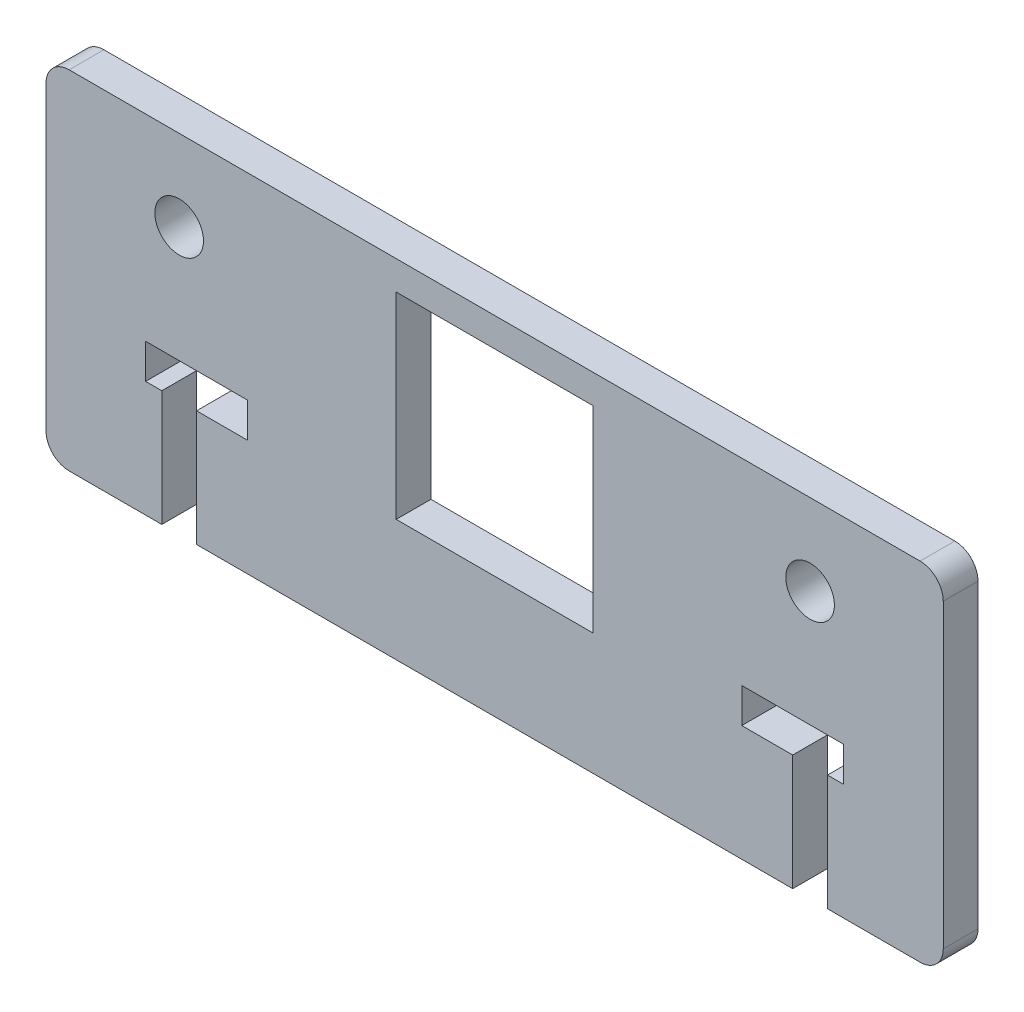
ISO-10303-21;
HEADER;
FILE_DESCRIPTION(('STEP AP214'),'2;1');
FILE_NAME('part.step','',(''),(''),'','','');
FILE_SCHEMA(('AUTOMOTIVE_DESIGN { 1 0 10303 214 1 1 1 1 }'));
ENDSEC;
DATA;
#1=APPLICATION_CONTEXT('core data for automotive mechanical design processes');
#2=APPLICATION_PROTOCOL_DEFINITION('international standard','automotive_design',2000,#1);
#3=PRODUCT_CONTEXT('',#1,'mechanical');
#4=PRODUCT('Part','Part','',(#3));
#5=PRODUCT_RELATED_PRODUCT_CATEGORY('part','',(#4));
#6=PRODUCT_DEFINITION_FORMATION('','',#4);
#7=PRODUCT_DEFINITION_CONTEXT('part definition',#1,'design');
#8=PRODUCT_DEFINITION('design','',#6,#7);
#9=PRODUCT_DEFINITION_SHAPE('','',#8);
#10=(LENGTH_UNIT() NAMED_UNIT(*) SI_UNIT(.MILLI.,.METRE.));
#11=(NAMED_UNIT(*) PLANE_ANGLE_UNIT() SI_UNIT($,.RADIAN.));
#12=(NAMED_UNIT(*) SI_UNIT($,.STERADIAN.) SOLID_ANGLE_UNIT());
#13=UNCERTAINTY_MEASURE_WITH_UNIT(LENGTH_MEASURE(1.E-05),#10,'distance_accuracy_value','');
#14=(GEOMETRIC_REPRESENTATION_CONTEXT(3) GLOBAL_UNCERTAINTY_ASSIGNED_CONTEXT((#13)) GLOBAL_UNIT_ASSIGNED_CONTEXT((#10,
#11,#12)) REPRESENTATION_CONTEXT('',''));
#15=CARTESIAN_POINT('',(0.,0.,0.));
#16=DIRECTION('',(0.,0.,1.));
#17=DIRECTION('',(1.,0.,0.));
#18=AXIS2_PLACEMENT_3D('',#15,#16,#17);
#19=CARTESIAN_POINT('',(0.,0.,1.5));
#20=DIRECTION('',(0.,0.,1.));
#21=DIRECTION('',(1.,0.,0.));
#22=AXIS2_PLACEMENT_3D('',#19,#20,#21);
#23=PLANE('',#22);
#24=CARTESIAN_POINT('',(27.94,53.4586120346529,1.5));
#25=DIRECTION('',(0.,0.,1.));
#26=DIRECTION('',(1.,0.,0.));
#27=AXIS2_PLACEMENT_3D('',#24,#25,#26);
#28=CIRCLE('',#27,1.05);
#29=CARTESIAN_POINT('',(28.99,53.4586120346529,1.5));
#30=VERTEX_POINT('',#29);
#31=EDGE_CURVE('E264',#30,#30,#28,.T.);
#32=ORIENTED_EDGE('',*,*,#31,.F.);
#33=EDGE_LOOP('',(#32));
#34=FACE_BOUND('',#33,.T.);
#35=DIRECTION('',(1.,0.,0.));
#36=VECTOR('',#35,1.);
#37=CARTESIAN_POINT('',(33.69,41.9586120346529,1.5));
#38=LINE('',#37,#36);
#39=CARTESIAN_POINT('',(28.69,41.9586120346529,1.5));
#40=VERTEX_POINT('',#39);
#41=CARTESIAN_POINT('',(32.69,41.9586120346529,1.5));
#42=VERTEX_POINT('',#41);
#43=EDGE_CURVE('E313',#40,#42,#38,.T.);
#44=ORIENTED_EDGE('',*,*,#43,.T.);
#45=CARTESIAN_POINT('',(32.69,42.9586120346529,1.5));
#46=DIRECTION('',(0.,0.,1.));
#47=DIRECTION('',(1.,0.,0.));
#48=AXIS2_PLACEMENT_3D('',#45,#46,#47);
#49=CIRCLE('',#48,1.);
#50=CARTESIAN_POINT('',(33.69,42.9586120346529,1.5));
#51=VERTEX_POINT('',#50);
#52=EDGE_CURVE('E502',#42,#51,#49,.T.);
#53=ORIENTED_EDGE('',*,*,#52,.T.);
#54=DIRECTION('',(0.,1.,0.));
#55=VECTOR('',#54,1.);
#56=CARTESIAN_POINT('',(33.69,56.9586120346529,1.5));
#57=LINE('',#56,#55);
#58=CARTESIAN_POINT('',(33.69,55.9586120346529,1.5));
#59=VERTEX_POINT('',#58);
#60=EDGE_CURVE('E317',#51,#59,#57,.T.);
#61=ORIENTED_EDGE('',*,*,#60,.T.);
#62=CARTESIAN_POINT('',(32.69,55.9586120346529,1.5));
#63=DIRECTION('',(0.,0.,1.));
#64=DIRECTION('',(1.,0.,0.));
#65=AXIS2_PLACEMENT_3D('',#62,#63,#64);
#66=CIRCLE('',#65,1.);
#67=CARTESIAN_POINT('',(32.69,56.9586120346529,1.5));
#68=VERTEX_POINT('',#67);
#69=EDGE_CURVE('E499',#59,#68,#66,.T.);
#70=ORIENTED_EDGE('',*,*,#69,.T.);
#71=DIRECTION('',(-1.,0.,0.));
#72=VECTOR('',#71,1.);
#73=CARTESIAN_POINT('',(14.32,56.9586120346529,1.5));
#74=LINE('',#73,#72);
#75=CARTESIAN_POINT('',(-4.05,56.9586120346529,1.5));
#76=VERTEX_POINT('',#75);
#77=EDGE_CURVE('E321',#68,#76,#74,.T.);
#78=ORIENTED_EDGE('',*,*,#77,.T.);
#79=CARTESIAN_POINT('',(-4.05,55.9586120346529,1.5));
#80=DIRECTION('',(0.,0.,1.));
#81=DIRECTION('',(1.,0.,0.));
#82=AXIS2_PLACEMENT_3D('',#79,#80,#81);
#83=CIRCLE('',#82,1.);
#84=CARTESIAN_POINT('',(-5.05,55.9586120346529,1.5));
#85=VERTEX_POINT('',#84);
#86=EDGE_CURVE('E494',#76,#85,#83,.T.);
#87=ORIENTED_EDGE('',*,*,#86,.T.);
#88=DIRECTION('',(0.,-1.,0.));
#89=VECTOR('',#88,1.);
#90=CARTESIAN_POINT('',(-5.05,41.9586120346529,1.5));
#91=LINE('',#90,#89);
#92=CARTESIAN_POINT('',(-5.05,42.9586120346529,1.5));
#93=VERTEX_POINT('',#92);
#94=EDGE_CURVE('E325',#85,#93,#91,.T.);
#95=ORIENTED_EDGE('',*,*,#94,.T.);
#96=CARTESIAN_POINT('',(-4.05,42.9586120346529,1.5));
#97=DIRECTION('',(0.,0.,1.));
#98=DIRECTION('',(1.,0.,0.));
#99=AXIS2_PLACEMENT_3D('',#96,#97,#98);
#100=CIRCLE('',#99,1.);
#101=CARTESIAN_POINT('',(-4.05,41.9586120346529,1.5));
#102=VERTEX_POINT('',#101);
#103=EDGE_CURVE('E54',#93,#102,#100,.T.);
#104=ORIENTED_EDGE('',*,*,#103,.T.);
#105=DIRECTION('',(1.,0.,0.));
#106=VECTOR('',#105,1.);
#107=CARTESIAN_POINT('',(-0.0499999999999987,41.9586120346529,1.5));
#108=LINE('',#107,#106);
#109=CARTESIAN_POINT('',(-0.0499999999999987,41.9586120346529,1.5));
#110=VERTEX_POINT('',#109);
#111=EDGE_CURVE('E328',#102,#110,#108,.T.);
#112=ORIENTED_EDGE('',*,*,#111,.T.);
#113=DIRECTION('',(0.,1.,0.));
#114=VECTOR('',#113,1.);
#115=CARTESIAN_POINT('',(-0.0500000000000014,46.9586120346529,1.5));
#116=LINE('',#115,#114);
#117=CARTESIAN_POINT('',(-0.0500000000000014,46.9586120346529,1.5));
#118=VERTEX_POINT('',#117);
#119=EDGE_CURVE('E331',#110,#118,#116,.T.);
#120=ORIENTED_EDGE('',*,*,#119,.T.);
#121=DIRECTION('',(-1.,0.,0.));
#122=VECTOR('',#121,1.);
#123=CARTESIAN_POINT('',(-0.749999999999999,46.9586120346529,1.5));
#124=LINE('',#123,#122);
#125=CARTESIAN_POINT('',(-0.749999999999999,46.9586120346529,1.5));
#126=VERTEX_POINT('',#125);
#127=EDGE_CURVE('E334',#118,#126,#124,.T.);
#128=ORIENTED_EDGE('',*,*,#127,.T.);
#129=DIRECTION('',(0.,1.,0.));
#130=VECTOR('',#129,1.);
#131=CARTESIAN_POINT('',(-0.749999999999999,48.4586120346529,1.5));
#132=LINE('',#131,#130);
#133=CARTESIAN_POINT('',(-0.749999999999999,48.4586120346529,1.5));
#134=VERTEX_POINT('',#133);
#135=EDGE_CURVE('E337',#126,#134,#132,.T.);
#136=ORIENTED_EDGE('',*,*,#135,.T.);
#137=DIRECTION('',(1.,0.,0.));
#138=VECTOR('',#137,1.);
#139=CARTESIAN_POINT('',(3.65,48.4586120346529,1.5));
#140=LINE('',#139,#138);
#141=CARTESIAN_POINT('',(3.65,48.4586120346529,1.5));
#142=VERTEX_POINT('',#141);
#143=EDGE_CURVE('E340',#134,#142,#140,.T.);
#144=ORIENTED_EDGE('',*,*,#143,.T.);
#145=DIRECTION('',(0.,-1.,0.));
#146=VECTOR('',#145,1.);
#147=CARTESIAN_POINT('',(3.65,46.9586120346529,1.5));
#148=LINE('',#147,#146);
#149=CARTESIAN_POINT('',(3.65,46.9586120346529,1.5));
#150=VERTEX_POINT('',#149);
#151=EDGE_CURVE('E343',#142,#150,#148,.T.);
#152=ORIENTED_EDGE('',*,*,#151,.T.);
#153=DIRECTION('',(-1.,0.,0.));
#154=VECTOR('',#153,1.);
#155=CARTESIAN_POINT('',(1.45,46.9586120346529,1.5));
#156=LINE('',#155,#154);
#157=CARTESIAN_POINT('',(1.45,46.9586120346529,1.5));
#158=VERTEX_POINT('',#157);
#159=EDGE_CURVE('E281',#150,#158,#156,.T.);
#160=ORIENTED_EDGE('',*,*,#159,.T.);
#161=DIRECTION('',(0.,-1.,0.));
#162=VECTOR('',#161,1.);
#163=CARTESIAN_POINT('',(1.45,41.9586120346529,1.5));
#164=LINE('',#163,#162);
#165=CARTESIAN_POINT('',(1.45,41.9586120346529,1.5));
#166=VERTEX_POINT('',#165);
#167=EDGE_CURVE('E285',#158,#166,#164,.T.);
#168=ORIENTED_EDGE('',*,*,#167,.T.);
#169=DIRECTION('',(1.,0.,0.));
#170=VECTOR('',#169,1.);
#171=CARTESIAN_POINT('',(1.45,41.9586120346529,1.5));
#172=LINE('',#171,#170);
#173=CARTESIAN_POINT('',(27.19,41.9586120346529,1.5));
#174=VERTEX_POINT('',#173);
#175=EDGE_CURVE('E289',#166,#174,#172,.T.);
#176=ORIENTED_EDGE('',*,*,#175,.T.);
#177=DIRECTION('',(0.,1.,0.));
#178=VECTOR('',#177,1.);
#179=CARTESIAN_POINT('',(27.19,41.9586120346529,1.5));
#180=LINE('',#179,#178);
#181=CARTESIAN_POINT('',(27.19,46.9586120346529,1.5));
#182=VERTEX_POINT('',#181);
#183=EDGE_CURVE('E292',#174,#182,#180,.T.);
#184=ORIENTED_EDGE('',*,*,#183,.T.);
#185=DIRECTION('',(-1.,0.,0.));
#186=VECTOR('',#185,1.);
#187=CARTESIAN_POINT('',(27.19,46.9586120346529,1.5));
#188=LINE('',#187,#186);
#189=CARTESIAN_POINT('',(24.99,46.9586120346529,1.5));
#190=VERTEX_POINT('',#189);
#191=EDGE_CURVE('E295',#182,#190,#188,.T.);
#192=ORIENTED_EDGE('',*,*,#191,.T.);
#193=DIRECTION('',(0.,1.,0.));
#194=VECTOR('',#193,1.);
#195=CARTESIAN_POINT('',(24.99,46.9586120346529,1.5));
#196=LINE('',#195,#194);
#197=CARTESIAN_POINT('',(24.99,48.4586120346529,1.5));
#198=VERTEX_POINT('',#197);
#199=EDGE_CURVE('E298',#190,#198,#196,.T.);
#200=ORIENTED_EDGE('',*,*,#199,.T.);
#201=DIRECTION('',(1.,0.,0.));
#202=VECTOR('',#201,1.);
#203=CARTESIAN_POINT('',(24.99,48.4586120346529,1.5));
#204=LINE('',#203,#202);
#205=CARTESIAN_POINT('',(29.39,48.4586120346529,1.5));
#206=VERTEX_POINT('',#205);
#207=EDGE_CURVE('E301',#198,#206,#204,.T.);
#208=ORIENTED_EDGE('',*,*,#207,.T.);
#209=DIRECTION('',(0.,-1.,0.));
#210=VECTOR('',#209,1.);
#211=CARTESIAN_POINT('',(29.39,48.4586120346529,1.5));
#212=LINE('',#211,#210);
#213=CARTESIAN_POINT('',(29.39,46.9586120346529,1.5));
#214=VERTEX_POINT('',#213);
#215=EDGE_CURVE('E304',#206,#214,#212,.T.);
#216=ORIENTED_EDGE('',*,*,#215,.T.);
#217=DIRECTION('',(-1.,0.,0.));
#218=VECTOR('',#217,1.);
#219=CARTESIAN_POINT('',(29.39,46.9586120346529,1.5));
#220=LINE('',#219,#218);
#221=CARTESIAN_POINT('',(28.69,46.9586120346529,1.5));
#222=VERTEX_POINT('',#221);
#223=EDGE_CURVE('E307',#214,#222,#220,.T.);
#224=ORIENTED_EDGE('',*,*,#223,.T.);
#225=DIRECTION('',(0.,-1.,0.));
#226=VECTOR('',#225,1.);
#227=CARTESIAN_POINT('',(28.69,46.9586120346529,1.5));
#228=LINE('',#227,#226);
#229=EDGE_CURVE('E310',#222,#40,#228,.T.);
#230=ORIENTED_EDGE('',*,*,#229,.T.);
#231=EDGE_LOOP('',(#44,#53,#61,#70,#78,#87,#95,#104,#112,#120,#128,#136,#144,#152,#160,#168,
#176,#184,#192,#200,#208,#216,#224,#230));
#232=FACE_BOUND('',#231,.T.);
#233=DIRECTION('',(-1.,0.,0.));
#234=VECTOR('',#233,1.);
#235=CARTESIAN_POINT('',(10.07,55.7086120346529,1.5));
#236=LINE('',#235,#234);
#237=CARTESIAN_POINT('',(18.57,55.7086120346529,1.5));
#238=VERTEX_POINT('',#237);
#239=CARTESIAN_POINT('',(10.07,55.7086120346529,1.5));
#240=VERTEX_POINT('',#239);
#241=EDGE_CURVE('E236',#238,#240,#236,.T.);
#242=ORIENTED_EDGE('',*,*,#241,.F.);
#243=DIRECTION('',(0.,1.,0.));
#244=VECTOR('',#243,1.);
#245=CARTESIAN_POINT('',(18.57,47.2086120346529,1.5));
#246=LINE('',#245,#244);
#247=CARTESIAN_POINT('',(18.57,47.2086120346529,1.5));
#248=VERTEX_POINT('',#247);
#249=EDGE_CURVE('E225',#248,#238,#246,.T.);
#250=ORIENTED_EDGE('',*,*,#249,.F.);
#251=DIRECTION('',(1.,0.,0.));
#252=VECTOR('',#251,1.);
#253=CARTESIAN_POINT('',(10.07,47.2086120346529,1.5));
#254=LINE('',#253,#252);
#255=CARTESIAN_POINT('',(10.07,47.2086120346529,1.5));
#256=VERTEX_POINT('',#255);
#257=EDGE_CURVE('E255',#256,#248,#254,.T.);
#258=ORIENTED_EDGE('',*,*,#257,.F.);
#259=DIRECTION('',(0.,-1.,0.));
#260=VECTOR('',#259,1.);
#261=CARTESIAN_POINT('',(10.07,47.2086120346529,1.5));
#262=LINE('',#261,#260);
#263=EDGE_CURVE('E251',#240,#256,#262,.T.);
#264=ORIENTED_EDGE('',*,*,#263,.F.);
#265=EDGE_LOOP('',(#242,#250,#258,#264));
#266=FACE_BOUND('',#265,.T.);
#267=CARTESIAN_POINT('',(0.699999999999999,53.4586120346529,1.5));
#268=DIRECTION('',(0.,0.,1.));
#269=DIRECTION('',(-1.,0.,0.));
#270=AXIS2_PLACEMENT_3D('',#267,#268,#269);
#271=CIRCLE('',#270,1.04999999999999);
#272=CARTESIAN_POINT('',(-0.34999999999999,53.4586120346529,1.5));
#273=VERTEX_POINT('',#272);
#274=EDGE_CURVE('E907',#273,#273,#271,.T.);
#275=ORIENTED_EDGE('',*,*,#274,.F.);
#276=EDGE_LOOP('',(#275));
#277=FACE_BOUND('',#276,.T.);
#278=ADVANCED_FACE('F38',(#34,#232,#266,#277),#23,.T.);
#279=CARTESIAN_POINT('',(0.,0.,0.));
#280=DIRECTION('',(0.,0.,1.));
#281=DIRECTION('',(1.,0.,0.));
#282=AXIS2_PLACEMENT_3D('',#279,#280,#281);
#283=PLANE('',#282);
#284=DIRECTION('',(0.,1.,0.));
#285=VECTOR('',#284,1.);
#286=CARTESIAN_POINT('',(33.69,56.9586120346529,0.));
#287=LINE('',#286,#285);
#288=CARTESIAN_POINT('',(33.69,42.9586120346529,0.));
#289=VERTEX_POINT('',#288);
#290=CARTESIAN_POINT('',(33.69,55.9586120346529,0.));
#291=VERTEX_POINT('',#290);
#292=EDGE_CURVE('E381',#289,#291,#287,.T.);
#293=ORIENTED_EDGE('',*,*,#292,.F.);
#294=CARTESIAN_POINT('',(32.69,42.9586120346529,0.));
#295=DIRECTION('',(0.,0.,1.));
#296=DIRECTION('',(1.,0.,0.));
#297=AXIS2_PLACEMENT_3D('',#294,#295,#296);
#298=CIRCLE('',#297,1.);
#299=CARTESIAN_POINT('',(32.69,41.9586120346529,0.));
#300=VERTEX_POINT('',#299);
#301=EDGE_CURVE('E488',#289,#300,#298,.F.);
#302=ORIENTED_EDGE('',*,*,#301,.T.);
#303=DIRECTION('',(1.,0.,0.));
#304=VECTOR('',#303,1.);
#305=CARTESIAN_POINT('',(33.69,41.9586120346529,0.));
#306=LINE('',#305,#304);
#307=CARTESIAN_POINT('',(28.69,41.9586120346529,0.));
#308=VERTEX_POINT('',#307);
#309=EDGE_CURVE('E377',#308,#300,#306,.T.);
#310=ORIENTED_EDGE('',*,*,#309,.F.);
#311=DIRECTION('',(0.,-1.,0.));
#312=VECTOR('',#311,1.);
#313=CARTESIAN_POINT('',(28.69,46.9586120346529,0.));
#314=LINE('',#313,#312);
#315=CARTESIAN_POINT('',(28.69,46.9586120346529,0.));
#316=VERTEX_POINT('',#315);
#317=EDGE_CURVE('E374',#316,#308,#314,.T.);
#318=ORIENTED_EDGE('',*,*,#317,.F.);
#319=DIRECTION('',(-1.,0.,0.));
#320=VECTOR('',#319,1.);
#321=CARTESIAN_POINT('',(29.39,46.9586120346529,0.));
#322=LINE('',#321,#320);
#323=CARTESIAN_POINT('',(29.39,46.9586120346529,0.));
#324=VERTEX_POINT('',#323);
#325=EDGE_CURVE('E371',#324,#316,#322,.T.);
#326=ORIENTED_EDGE('',*,*,#325,.F.);
#327=DIRECTION('',(0.,-1.,0.));
#328=VECTOR('',#327,1.);
#329=CARTESIAN_POINT('',(29.39,48.4586120346529,0.));
#330=LINE('',#329,#328);
#331=CARTESIAN_POINT('',(29.39,48.4586120346529,0.));
#332=VERTEX_POINT('',#331);
#333=EDGE_CURVE('E368',#332,#324,#330,.T.);
#334=ORIENTED_EDGE('',*,*,#333,.F.);
#335=DIRECTION('',(1.,0.,0.));
#336=VECTOR('',#335,1.);
#337=CARTESIAN_POINT('',(24.99,48.4586120346529,0.));
#338=LINE('',#337,#336);
#339=CARTESIAN_POINT('',(24.99,48.4586120346529,0.));
#340=VERTEX_POINT('',#339);
#341=EDGE_CURVE('E365',#340,#332,#338,.T.);
#342=ORIENTED_EDGE('',*,*,#341,.F.);
#343=DIRECTION('',(0.,1.,0.));
#344=VECTOR('',#343,1.);
#345=CARTESIAN_POINT('',(24.99,46.9586120346529,0.));
#346=LINE('',#345,#344);
#347=CARTESIAN_POINT('',(24.99,46.9586120346529,0.));
#348=VERTEX_POINT('',#347);
#349=EDGE_CURVE('E362',#348,#340,#346,.T.);
#350=ORIENTED_EDGE('',*,*,#349,.F.);
#351=DIRECTION('',(-1.,0.,0.));
#352=VECTOR('',#351,1.);
#353=CARTESIAN_POINT('',(27.19,46.9586120346529,0.));
#354=LINE('',#353,#352);
#355=CARTESIAN_POINT('',(27.19,46.9586120346529,0.));
#356=VERTEX_POINT('',#355);
#357=EDGE_CURVE('E359',#356,#348,#354,.T.);
#358=ORIENTED_EDGE('',*,*,#357,.F.);
#359=DIRECTION('',(0.,1.,0.));
#360=VECTOR('',#359,1.);
#361=CARTESIAN_POINT('',(27.19,41.9586120346529,0.));
#362=LINE('',#361,#360);
#363=CARTESIAN_POINT('',(27.19,41.9586120346529,0.));
#364=VERTEX_POINT('',#363);
#365=EDGE_CURVE('E356',#364,#356,#362,.T.);
#366=ORIENTED_EDGE('',*,*,#365,.F.);
#367=DIRECTION('',(1.,0.,0.));
#368=VECTOR('',#367,1.);
#369=CARTESIAN_POINT('',(1.45,41.9586120346529,0.));
#370=LINE('',#369,#368);
#371=CARTESIAN_POINT('',(1.45,41.9586120346529,0.));
#372=VERTEX_POINT('',#371);
#373=EDGE_CURVE('E353',#372,#364,#370,.T.);
#374=ORIENTED_EDGE('',*,*,#373,.F.);
#375=DIRECTION('',(0.,-1.,0.));
#376=VECTOR('',#375,1.);
#377=CARTESIAN_POINT('',(1.45,41.9586120346529,0.));
#378=LINE('',#377,#376);
#379=CARTESIAN_POINT('',(1.45,46.9586120346529,0.));
#380=VERTEX_POINT('',#379);
#381=EDGE_CURVE('E350',#380,#372,#378,.T.);
#382=ORIENTED_EDGE('',*,*,#381,.F.);
#383=DIRECTION('',(-1.,0.,0.));
#384=VECTOR('',#383,1.);
#385=CARTESIAN_POINT('',(1.45,46.9586120346529,0.));
#386=LINE('',#385,#384);
#387=CARTESIAN_POINT('',(3.65,46.9586120346529,0.));
#388=VERTEX_POINT('',#387);
#389=EDGE_CURVE('E245',#388,#380,#386,.T.);
#390=ORIENTED_EDGE('',*,*,#389,.F.);
#391=DIRECTION('',(0.,-1.,0.));
#392=VECTOR('',#391,1.);
#393=CARTESIAN_POINT('',(3.65,46.9586120346529,0.));
#394=LINE('',#393,#392);
#395=CARTESIAN_POINT('',(3.65,48.4586120346529,0.));
#396=VERTEX_POINT('',#395);
#397=EDGE_CURVE('E286',#396,#388,#394,.T.);
#398=ORIENTED_EDGE('',*,*,#397,.F.);
#399=DIRECTION('',(1.,0.,0.));
#400=VECTOR('',#399,1.);
#401=CARTESIAN_POINT('',(3.65,48.4586120346529,0.));
#402=LINE('',#401,#400);
#403=CARTESIAN_POINT('',(-0.749999999999999,48.4586120346529,0.));
#404=VERTEX_POINT('',#403);
#405=EDGE_CURVE('E404',#404,#396,#402,.T.);
#406=ORIENTED_EDGE('',*,*,#405,.F.);
#407=DIRECTION('',(0.,1.,0.));
#408=VECTOR('',#407,1.);
#409=CARTESIAN_POINT('',(-0.749999999999999,48.4586120346529,0.));
#410=LINE('',#409,#408);
#411=CARTESIAN_POINT('',(-0.749999999999999,46.9586120346529,0.));
#412=VERTEX_POINT('',#411);
#413=EDGE_CURVE('E401',#412,#404,#410,.T.);
#414=ORIENTED_EDGE('',*,*,#413,.F.);
#415=DIRECTION('',(-1.,0.,0.));
#416=VECTOR('',#415,1.);
#417=CARTESIAN_POINT('',(-0.749999999999999,46.9586120346529,0.));
#418=LINE('',#417,#416);
#419=CARTESIAN_POINT('',(-0.0500000000000014,46.9586120346529,0.));
#420=VERTEX_POINT('',#419);
#421=EDGE_CURVE('E398',#420,#412,#418,.T.);
#422=ORIENTED_EDGE('',*,*,#421,.F.);
#423=DIRECTION('',(0.,1.,0.));
#424=VECTOR('',#423,1.);
#425=CARTESIAN_POINT('',(-0.0500000000000014,46.9586120346529,0.));
#426=LINE('',#425,#424);
#427=CARTESIAN_POINT('',(-0.0499999999999987,41.9586120346529,0.));
#428=VERTEX_POINT('',#427);
#429=EDGE_CURVE('E395',#428,#420,#426,.T.);
#430=ORIENTED_EDGE('',*,*,#429,.F.);
#431=DIRECTION('',(1.,0.,0.));
#432=VECTOR('',#431,1.);
#433=CARTESIAN_POINT('',(-0.0499999999999987,41.9586120346529,0.));
#434=LINE('',#433,#432);
#435=CARTESIAN_POINT('',(-4.05,41.9586120346529,0.));
#436=VERTEX_POINT('',#435);
#437=EDGE_CURVE('E392',#436,#428,#434,.T.);
#438=ORIENTED_EDGE('',*,*,#437,.F.);
#439=CARTESIAN_POINT('',(-4.05,42.9586120346529,0.));
#440=DIRECTION('',(0.,0.,1.));
#441=DIRECTION('',(1.,0.,0.));
#442=AXIS2_PLACEMENT_3D('',#439,#440,#441);
#443=CIRCLE('',#442,1.);
#444=CARTESIAN_POINT('',(-5.05,42.9586120346529,0.));
#445=VERTEX_POINT('',#444);
#446=EDGE_CURVE('E482',#436,#445,#443,.F.);
#447=ORIENTED_EDGE('',*,*,#446,.T.);
#448=DIRECTION('',(0.,-1.,0.));
#449=VECTOR('',#448,1.);
#450=CARTESIAN_POINT('',(-5.05,41.9586120346529,0.));
#451=LINE('',#450,#449);
#452=CARTESIAN_POINT('',(-5.05,55.9586120346529,0.));
#453=VERTEX_POINT('',#452);
#454=EDGE_CURVE('E389',#453,#445,#451,.T.);
#455=ORIENTED_EDGE('',*,*,#454,.F.);
#456=CARTESIAN_POINT('',(-4.05,55.9586120346529,0.));
#457=DIRECTION('',(0.,0.,1.));
#458=DIRECTION('',(1.,0.,0.));
#459=AXIS2_PLACEMENT_3D('',#456,#457,#458);
#460=CIRCLE('',#459,1.);
#461=CARTESIAN_POINT('',(-4.05,56.9586120346529,0.));
#462=VERTEX_POINT('',#461);
#463=EDGE_CURVE('E479',#453,#462,#460,.F.);
#464=ORIENTED_EDGE('',*,*,#463,.T.);
#465=DIRECTION('',(-1.,0.,0.));
#466=VECTOR('',#465,1.);
#467=CARTESIAN_POINT('',(-5.05,56.9586120346529,0.));
#468=LINE('',#467,#466);
#469=CARTESIAN_POINT('',(32.69,56.9586120346529,0.));
#470=VERTEX_POINT('',#469);
#471=EDGE_CURVE('E385',#470,#462,#468,.T.);
#472=ORIENTED_EDGE('',*,*,#471,.F.);
#473=CARTESIAN_POINT('',(32.69,55.9586120346529,0.));
#474=DIRECTION('',(0.,0.,1.));
#475=DIRECTION('',(1.,0.,0.));
#476=AXIS2_PLACEMENT_3D('',#473,#474,#475);
#477=CIRCLE('',#476,1.);
#478=EDGE_CURVE('E485',#470,#291,#477,.F.);
#479=ORIENTED_EDGE('',*,*,#478,.T.);
#480=EDGE_LOOP('',(#293,#302,#310,#318,#326,#334,#342,#350,#358,#366,#374,#382,#390,#398,#406,
#414,#422,#430,#438,#447,#455,#464,#472,#479));
#481=FACE_BOUND('',#480,.T.);
#482=DIRECTION('',(0.,1.,0.));
#483=VECTOR('',#482,1.);
#484=CARTESIAN_POINT('',(18.57,47.2086120346529,0.));
#485=LINE('',#484,#483);
#486=CARTESIAN_POINT('',(18.57,47.2086120346529,0.));
#487=VERTEX_POINT('',#486);
#488=CARTESIAN_POINT('',(18.57,55.7086120346529,0.));
#489=VERTEX_POINT('',#488);
#490=EDGE_CURVE('E261',#487,#489,#485,.T.);
#491=ORIENTED_EDGE('',*,*,#490,.T.);
#492=DIRECTION('',(-1.,0.,0.));
#493=VECTOR('',#492,1.);
#494=CARTESIAN_POINT('',(10.07,55.7086120346529,0.));
#495=LINE('',#494,#493);
#496=CARTESIAN_POINT('',(10.07,55.7086120346529,0.));
#497=VERTEX_POINT('',#496);
#498=EDGE_CURVE('E243',#489,#497,#495,.T.);
#499=ORIENTED_EDGE('',*,*,#498,.T.);
#500=DIRECTION('',(0.,-1.,0.));
#501=VECTOR('',#500,1.);
#502=CARTESIAN_POINT('',(10.07,47.2086120346529,0.));
#503=LINE('',#502,#501);
#504=CARTESIAN_POINT('',(10.07,47.2086120346529,0.));
#505=VERTEX_POINT('',#504);
#506=EDGE_CURVE('E267',#497,#505,#503,.T.);
#507=ORIENTED_EDGE('',*,*,#506,.T.);
#508=DIRECTION('',(1.,0.,0.));
#509=VECTOR('',#508,1.);
#510=CARTESIAN_POINT('',(10.07,47.2086120346529,0.));
#511=LINE('',#510,#509);
#512=EDGE_CURVE('E237',#505,#487,#511,.T.);
#513=ORIENTED_EDGE('',*,*,#512,.T.);
#514=EDGE_LOOP('',(#491,#499,#507,#513));
#515=FACE_BOUND('',#514,.T.);
#516=CARTESIAN_POINT('',(27.94,53.4586120346529,0.));
#517=DIRECTION('',(0.,0.,1.));
#518=DIRECTION('',(1.,0.,0.));
#519=AXIS2_PLACEMENT_3D('',#516,#517,#518);
#520=CIRCLE('',#519,1.05);
#521=CARTESIAN_POINT('',(28.99,53.4586120346529,0.));
#522=VERTEX_POINT('',#521);
#523=EDGE_CURVE('E901',#522,#522,#520,.T.);
#524=ORIENTED_EDGE('',*,*,#523,.T.);
#525=EDGE_LOOP('',(#524));
#526=FACE_BOUND('',#525,.T.);
#527=CARTESIAN_POINT('',(0.699999999999999,53.4586120346529,0.));
#528=DIRECTION('',(0.,0.,1.));
#529=DIRECTION('',(-1.,0.,0.));
#530=AXIS2_PLACEMENT_3D('',#527,#528,#529);
#531=CIRCLE('',#530,1.04999999999999);
#532=CARTESIAN_POINT('',(-0.34999999999999,53.4586120346529,0.));
#533=VERTEX_POINT('',#532);
#534=EDGE_CURVE('E904',#533,#533,#531,.T.);
#535=ORIENTED_EDGE('',*,*,#534,.T.);
#536=EDGE_LOOP('',(#535));
#537=FACE_BOUND('',#536,.T.);
#538=ADVANCED_FACE('F524',(#481,#515,#526,#537),#283,.F.);
#539=CARTESIAN_POINT('',(1.45,46.9586120346529,1.5));
#540=DIRECTION('',(0.,-1.,0.));
#541=DIRECTION('',(0.,0.,-1.));
#542=AXIS2_PLACEMENT_3D('',#539,#540,#541);
#543=PLANE('',#542);
#544=ORIENTED_EDGE('',*,*,#389,.T.);
#545=DIRECTION('',(0.,0.,-1.));
#546=VECTOR('',#545,1.);
#547=CARTESIAN_POINT('',(1.45,46.9586120346529,1.5));
#548=LINE('',#547,#546);
#549=EDGE_CURVE('E468',#158,#380,#548,.T.);
#550=ORIENTED_EDGE('',*,*,#549,.F.);
#551=ORIENTED_EDGE('',*,*,#159,.F.);
#552=DIRECTION('',(0.,0.,-1.));
#553=VECTOR('',#552,1.);
#554=CARTESIAN_POINT('',(3.65,46.9586120346529,1.5));
#555=LINE('',#554,#553);
#556=EDGE_CURVE('E346',#150,#388,#555,.T.);
#557=ORIENTED_EDGE('',*,*,#556,.T.);
#558=EDGE_LOOP('',(#544,#550,#551,#557));
#559=FACE_BOUND('',#558,.T.);
#560=ADVANCED_FACE('F563',(#559),#543,.F.);
#561=CARTESIAN_POINT('',(1.45,41.9586120346529,1.5));
#562=DIRECTION('',(1.,0.,0.));
#563=DIRECTION('',(0.,1.,0.));
#564=AXIS2_PLACEMENT_3D('',#561,#562,#563);
#565=PLANE('',#564);
#566=ORIENTED_EDGE('',*,*,#381,.T.);
#567=DIRECTION('',(0.,0.,-1.));
#568=VECTOR('',#567,1.);
#569=CARTESIAN_POINT('',(1.45,41.9586120346529,1.5));
#570=LINE('',#569,#568);
#571=EDGE_CURVE('E464',#166,#372,#570,.T.);
#572=ORIENTED_EDGE('',*,*,#571,.F.);
#573=ORIENTED_EDGE('',*,*,#167,.F.);
#574=ORIENTED_EDGE('',*,*,#549,.T.);
#575=EDGE_LOOP('',(#566,#572,#573,#574));
#576=FACE_BOUND('',#575,.T.);
#577=ADVANCED_FACE('F568',(#576),#565,.F.);
#578=CARTESIAN_POINT('',(1.45,41.9586120346529,1.5));
#579=DIRECTION('',(0.,1.,0.));
#580=DIRECTION('',(0.,0.,1.));
#581=AXIS2_PLACEMENT_3D('',#578,#579,#580);
#582=PLANE('',#581);
#583=ORIENTED_EDGE('',*,*,#373,.T.);
#584=DIRECTION('',(0.,0.,-1.));
#585=VECTOR('',#584,1.);
#586=CARTESIAN_POINT('',(27.19,41.9586120346529,1.5));
#587=LINE('',#586,#585);
#588=EDGE_CURVE('E460',#174,#364,#587,.T.);
#589=ORIENTED_EDGE('',*,*,#588,.F.);
#590=ORIENTED_EDGE('',*,*,#175,.F.);
#591=ORIENTED_EDGE('',*,*,#571,.T.);
#592=EDGE_LOOP('',(#583,#589,#590,#591));
#593=FACE_BOUND('',#592,.T.);
#594=ADVANCED_FACE('F571',(#593),#582,.F.);
#595=CARTESIAN_POINT('',(27.19,41.9586120346529,1.5));
#596=DIRECTION('',(-1.,0.,0.));
#597=DIRECTION('',(0.,-1.,0.));
#598=AXIS2_PLACEMENT_3D('',#595,#596,#597);
#599=PLANE('',#598);
#600=ORIENTED_EDGE('',*,*,#365,.T.);
#601=DIRECTION('',(0.,0.,-1.));
#602=VECTOR('',#601,1.);
#603=CARTESIAN_POINT('',(27.19,46.9586120346529,1.5));
#604=LINE('',#603,#602);
#605=EDGE_CURVE('E456',#182,#356,#604,.T.);
#606=ORIENTED_EDGE('',*,*,#605,.F.);
#607=ORIENTED_EDGE('',*,*,#183,.F.);
#608=ORIENTED_EDGE('',*,*,#588,.T.);
#609=EDGE_LOOP('',(#600,#606,#607,#608));
#610=FACE_BOUND('',#609,.T.);
#611=ADVANCED_FACE('F576',(#610),#599,.F.);
#612=CARTESIAN_POINT('',(27.19,46.9586120346529,1.5));
#613=DIRECTION('',(0.,-1.,0.));
#614=DIRECTION('',(0.,0.,-1.));
#615=AXIS2_PLACEMENT_3D('',#612,#613,#614);
#616=PLANE('',#615);
#617=ORIENTED_EDGE('',*,*,#357,.T.);
#618=DIRECTION('',(0.,0.,-1.));
#619=VECTOR('',#618,1.);
#620=CARTESIAN_POINT('',(24.99,46.9586120346529,1.5));
#621=LINE('',#620,#619);
#622=EDGE_CURVE('E452',#190,#348,#621,.T.);
#623=ORIENTED_EDGE('',*,*,#622,.F.);
#624=ORIENTED_EDGE('',*,*,#191,.F.);
#625=ORIENTED_EDGE('',*,*,#605,.T.);
#626=EDGE_LOOP('',(#617,#623,#624,#625));
#627=FACE_BOUND('',#626,.T.);
#628=ADVANCED_FACE('F582',(#627),#616,.F.);
#629=CARTESIAN_POINT('',(24.99,46.9586120346529,1.5));
#630=DIRECTION('',(-1.,0.,0.));
#631=DIRECTION('',(0.,0.,1.));
#632=AXIS2_PLACEMENT_3D('',#629,#630,#631);
#633=PLANE('',#632);
#634=ORIENTED_EDGE('',*,*,#349,.T.);
#635=DIRECTION('',(0.,0.,-1.));
#636=VECTOR('',#635,1.);
#637=CARTESIAN_POINT('',(24.99,48.4586120346529,1.5));
#638=LINE('',#637,#636);
#639=EDGE_CURVE('E448',#198,#340,#638,.T.);
#640=ORIENTED_EDGE('',*,*,#639,.F.);
#641=ORIENTED_EDGE('',*,*,#199,.F.);
#642=ORIENTED_EDGE('',*,*,#622,.T.);
#643=EDGE_LOOP('',(#634,#640,#641,#642));
#644=FACE_BOUND('',#643,.T.);
#645=ADVANCED_FACE('F586',(#644),#633,.F.);
#646=CARTESIAN_POINT('',(24.99,48.4586120346529,1.5));
#647=DIRECTION('',(0.,1.,0.));
#648=DIRECTION('',(0.,0.,1.));
#649=AXIS2_PLACEMENT_3D('',#646,#647,#648);
#650=PLANE('',#649);
#651=ORIENTED_EDGE('',*,*,#341,.T.);
#652=DIRECTION('',(0.,0.,-1.));
#653=VECTOR('',#652,1.);
#654=CARTESIAN_POINT('',(29.39,48.4586120346529,1.5));
#655=LINE('',#654,#653);
#656=EDGE_CURVE('E444',#206,#332,#655,.T.);
#657=ORIENTED_EDGE('',*,*,#656,.F.);
#658=ORIENTED_EDGE('',*,*,#207,.F.);
#659=ORIENTED_EDGE('',*,*,#639,.T.);
#660=EDGE_LOOP('',(#651,#657,#658,#659));
#661=FACE_BOUND('',#660,.T.);
#662=ADVANCED_FACE('F591',(#661),#650,.F.);
#663=CARTESIAN_POINT('',(29.39,48.4586120346529,1.5));
#664=DIRECTION('',(1.,0.,0.));
#665=DIRECTION('',(0.,0.,-1.));
#666=AXIS2_PLACEMENT_3D('',#663,#664,#665);
#667=PLANE('',#666);
#668=ORIENTED_EDGE('',*,*,#333,.T.);
#669=DIRECTION('',(0.,0.,-1.));
#670=VECTOR('',#669,1.);
#671=CARTESIAN_POINT('',(29.39,46.9586120346529,1.5));
#672=LINE('',#671,#670);
#673=EDGE_CURVE('E440',#214,#324,#672,.T.);
#674=ORIENTED_EDGE('',*,*,#673,.F.);
#675=ORIENTED_EDGE('',*,*,#215,.F.);
#676=ORIENTED_EDGE('',*,*,#656,.T.);
#677=EDGE_LOOP('',(#668,#674,#675,#676));
#678=FACE_BOUND('',#677,.T.);
#679=ADVANCED_FACE('F597',(#678),#667,.F.);
#680=CARTESIAN_POINT('',(29.39,46.9586120346529,1.5));
#681=DIRECTION('',(0.,-1.,0.));
#682=DIRECTION('',(1.,0.,0.));
#683=AXIS2_PLACEMENT_3D('',#680,#681,#682);
#684=PLANE('',#683);
#685=ORIENTED_EDGE('',*,*,#325,.T.);
#686=DIRECTION('',(0.,0.,-1.));
#687=VECTOR('',#686,1.);
#688=CARTESIAN_POINT('',(28.69,46.9586120346529,1.5));
#689=LINE('',#688,#687);
#690=EDGE_CURVE('E436',#222,#316,#689,.T.);
#691=ORIENTED_EDGE('',*,*,#690,.F.);
#692=ORIENTED_EDGE('',*,*,#223,.F.);
#693=ORIENTED_EDGE('',*,*,#673,.T.);
#694=EDGE_LOOP('',(#685,#691,#692,#693));
#695=FACE_BOUND('',#694,.T.);
#696=ADVANCED_FACE('F601',(#695),#684,.F.);
#697=CARTESIAN_POINT('',(28.69,46.9586120346529,1.5));
#698=DIRECTION('',(1.,0.,0.));
#699=DIRECTION('',(0.,1.,0.));
#700=AXIS2_PLACEMENT_3D('',#697,#698,#699);
#701=PLANE('',#700);
#702=ORIENTED_EDGE('',*,*,#317,.T.);
#703=DIRECTION('',(0.,0.,-1.));
#704=VECTOR('',#703,1.);
#705=CARTESIAN_POINT('',(28.69,41.9586120346529,1.5));
#706=LINE('',#705,#704);
#707=EDGE_CURVE('E432',#40,#308,#706,.T.);
#708=ORIENTED_EDGE('',*,*,#707,.F.);
#709=ORIENTED_EDGE('',*,*,#229,.F.);
#710=ORIENTED_EDGE('',*,*,#690,.T.);
#711=EDGE_LOOP('',(#702,#708,#709,#710));
#712=FACE_BOUND('',#711,.T.);
#713=ADVANCED_FACE('F606',(#712),#701,.F.);
#714=CARTESIAN_POINT('',(33.69,41.9586120346529,1.5));
#715=DIRECTION('',(0.,1.,0.));
#716=DIRECTION('',(0.,0.,1.));
#717=AXIS2_PLACEMENT_3D('',#714,#715,#716);
#718=PLANE('',#717);
#719=ORIENTED_EDGE('',*,*,#309,.T.);
#720=DIRECTION('',(0.,0.,-1.));
#721=VECTOR('',#720,1.);
#722=CARTESIAN_POINT('',(32.69,41.9586120346529,1.5));
#723=LINE('',#722,#721);
#724=EDGE_CURVE('E491',#300,#42,#723,.F.);
#725=ORIENTED_EDGE('',*,*,#724,.T.);
#726=ORIENTED_EDGE('',*,*,#43,.F.);
#727=ORIENTED_EDGE('',*,*,#707,.T.);
#728=EDGE_LOOP('',(#719,#725,#726,#727));
#729=FACE_BOUND('',#728,.T.);
#730=ADVANCED_FACE('F661',(#729),#718,.F.);
#731=CARTESIAN_POINT('',(33.69,56.9586120346529,1.5));
#732=DIRECTION('',(-1.,0.,0.));
#733=DIRECTION('',(0.,-1.,0.));
#734=AXIS2_PLACEMENT_3D('',#731,#732,#733);
#735=PLANE('',#734);
#736=ORIENTED_EDGE('',*,*,#60,.F.);
#737=DIRECTION('',(0.,0.,-1.));
#738=VECTOR('',#737,1.);
#739=CARTESIAN_POINT('',(33.69,42.9586120346529,1.5));
#740=LINE('',#739,#738);
#741=EDGE_CURVE('E475',#51,#289,#740,.T.);
#742=ORIENTED_EDGE('',*,*,#741,.T.);
#743=ORIENTED_EDGE('',*,*,#292,.T.);
#744=DIRECTION('',(0.,0.,-1.));
#745=VECTOR('',#744,1.);
#746=CARTESIAN_POINT('',(33.69,55.9586120346529,1.5));
#747=LINE('',#746,#745);
#748=EDGE_CURVE('E472',#291,#59,#747,.F.);
#749=ORIENTED_EDGE('',*,*,#748,.T.);
#750=EDGE_LOOP('',(#736,#742,#743,#749));
#751=FACE_BOUND('',#750,.T.);
#752=ADVANCED_FACE('F616',(#751),#735,.F.);
#753=CARTESIAN_POINT('',(-5.05,56.9586120346529,1.5));
#754=DIRECTION('',(0.,-1.,0.));
#755=DIRECTION('',(1.,0.,0.));
#756=AXIS2_PLACEMENT_3D('',#753,#754,#755);
#757=PLANE('',#756);
#758=ORIENTED_EDGE('',*,*,#77,.F.);
#759=DIRECTION('',(0.,0.,-1.));
#760=VECTOR('',#759,1.);
#761=CARTESIAN_POINT('',(32.69,56.9586120346529,1.5));
#762=LINE('',#761,#760);
#763=EDGE_CURVE('E508',#68,#470,#762,.T.);
#764=ORIENTED_EDGE('',*,*,#763,.T.);
#765=ORIENTED_EDGE('',*,*,#471,.T.);
#766=DIRECTION('',(0.,0.,-1.));
#767=VECTOR('',#766,1.);
#768=CARTESIAN_POINT('',(-4.05,56.9586120346529,1.5));
#769=LINE('',#768,#767);
#770=EDGE_CURVE('E505',#462,#76,#769,.F.);
#771=ORIENTED_EDGE('',*,*,#770,.T.);
#772=EDGE_LOOP('',(#758,#764,#765,#771));
#773=FACE_BOUND('',#772,.T.);
#774=ADVANCED_FACE('F625',(#773),#757,.F.);
#775=CARTESIAN_POINT('',(-5.05,41.9586120346529,1.5));
#776=DIRECTION('',(1.,0.,0.));
#777=DIRECTION('',(0.,0.,-1.));
#778=AXIS2_PLACEMENT_3D('',#775,#776,#777);
#779=PLANE('',#778);
#780=ORIENTED_EDGE('',*,*,#454,.T.);
#781=DIRECTION('',(0.,0.,-1.));
#782=VECTOR('',#781,1.);
#783=CARTESIAN_POINT('',(-5.05,42.9586120346529,1.5));
#784=LINE('',#783,#782);
#785=EDGE_CURVE('E11',#445,#93,#784,.F.);
#786=ORIENTED_EDGE('',*,*,#785,.T.);
#787=ORIENTED_EDGE('',*,*,#94,.F.);
#788=DIRECTION('',(0.,0.,-1.));
#789=VECTOR('',#788,1.);
#790=CARTESIAN_POINT('',(-5.05,55.9586120346529,1.5));
#791=LINE('',#790,#789);
#792=EDGE_CURVE('E47',#85,#453,#791,.T.);
#793=ORIENTED_EDGE('',*,*,#792,.T.);
#794=EDGE_LOOP('',(#780,#786,#787,#793));
#795=FACE_BOUND('',#794,.T.);
#796=ADVANCED_FACE('F519',(#795),#779,.F.);
#797=CARTESIAN_POINT('',(-0.0499999999999987,41.9586120346529,1.5));
#798=DIRECTION('',(0.,1.,0.));
#799=DIRECTION('',(-1.,0.,0.));
#800=AXIS2_PLACEMENT_3D('',#797,#798,#799);
#801=PLANE('',#800);
#802=ORIENTED_EDGE('',*,*,#111,.F.);
#803=DIRECTION('',(0.,0.,-1.));
#804=VECTOR('',#803,1.);
#805=CARTESIAN_POINT('',(-4.05,41.9586120346529,1.5));
#806=LINE('',#805,#804);
#807=EDGE_CURVE('E512',#102,#436,#806,.T.);
#808=ORIENTED_EDGE('',*,*,#807,.T.);
#809=ORIENTED_EDGE('',*,*,#437,.T.);
#810=DIRECTION('',(0.,0.,-1.));
#811=VECTOR('',#810,1.);
#812=CARTESIAN_POINT('',(-0.0499999999999987,41.9586120346529,1.5));
#813=LINE('',#812,#811);
#814=EDGE_CURVE('E428',#110,#428,#813,.T.);
#815=ORIENTED_EDGE('',*,*,#814,.F.);
#816=EDGE_LOOP('',(#802,#808,#809,#815));
#817=FACE_BOUND('',#816,.T.);
#818=ADVANCED_FACE('F533',(#817),#801,.F.);
#819=CARTESIAN_POINT('',(-0.0500000000000014,46.9586120346529,1.5));
#820=DIRECTION('',(-1.,0.,0.));
#821=DIRECTION('',(0.,-1.,0.));
#822=AXIS2_PLACEMENT_3D('',#819,#820,#821);
#823=PLANE('',#822);
#824=ORIENTED_EDGE('',*,*,#429,.T.);
#825=DIRECTION('',(0.,0.,-1.));
#826=VECTOR('',#825,1.);
#827=CARTESIAN_POINT('',(-0.0500000000000014,46.9586120346529,1.5));
#828=LINE('',#827,#826);
#829=EDGE_CURVE('E424',#118,#420,#828,.T.);
#830=ORIENTED_EDGE('',*,*,#829,.F.);
#831=ORIENTED_EDGE('',*,*,#119,.F.);
#832=ORIENTED_EDGE('',*,*,#814,.T.);
#833=EDGE_LOOP('',(#824,#830,#831,#832));
#834=FACE_BOUND('',#833,.T.);
#835=ADVANCED_FACE('F540',(#834),#823,.F.);
#836=CARTESIAN_POINT('',(-0.749999999999999,46.9586120346529,1.5));
#837=DIRECTION('',(0.,-1.,0.));
#838=DIRECTION('',(1.,0.,0.));
#839=AXIS2_PLACEMENT_3D('',#836,#837,#838);
#840=PLANE('',#839);
#841=ORIENTED_EDGE('',*,*,#421,.T.);
#842=DIRECTION('',(0.,0.,-1.));
#843=VECTOR('',#842,1.);
#844=CARTESIAN_POINT('',(-0.749999999999999,46.9586120346529,1.5));
#845=LINE('',#844,#843);
#846=EDGE_CURVE('E420',#126,#412,#845,.T.);
#847=ORIENTED_EDGE('',*,*,#846,.F.);
#848=ORIENTED_EDGE('',*,*,#127,.F.);
#849=ORIENTED_EDGE('',*,*,#829,.T.);
#850=EDGE_LOOP('',(#841,#847,#848,#849));
#851=FACE_BOUND('',#850,.T.);
#852=ADVANCED_FACE('F543',(#851),#840,.F.);
#853=CARTESIAN_POINT('',(-0.749999999999999,48.4586120346529,1.5));
#854=DIRECTION('',(-1.,0.,0.));
#855=DIRECTION('',(0.,0.,1.));
#856=AXIS2_PLACEMENT_3D('',#853,#854,#855);
#857=PLANE('',#856);
#858=ORIENTED_EDGE('',*,*,#413,.T.);
#859=DIRECTION('',(0.,0.,-1.));
#860=VECTOR('',#859,1.);
#861=CARTESIAN_POINT('',(-0.749999999999999,48.4586120346529,1.5));
#862=LINE('',#861,#860);
#863=EDGE_CURVE('E416',#134,#404,#862,.T.);
#864=ORIENTED_EDGE('',*,*,#863,.F.);
#865=ORIENTED_EDGE('',*,*,#135,.F.);
#866=ORIENTED_EDGE('',*,*,#846,.T.);
#867=EDGE_LOOP('',(#858,#864,#865,#866));
#868=FACE_BOUND('',#867,.T.);
#869=ADVANCED_FACE('F548',(#868),#857,.F.);
#870=CARTESIAN_POINT('',(3.65,48.4586120346529,1.5));
#871=DIRECTION('',(0.,1.,0.));
#872=DIRECTION('',(0.,0.,1.));
#873=AXIS2_PLACEMENT_3D('',#870,#871,#872);
#874=PLANE('',#873);
#875=ORIENTED_EDGE('',*,*,#405,.T.);
#876=DIRECTION('',(0.,0.,-1.));
#877=VECTOR('',#876,1.);
#878=CARTESIAN_POINT('',(3.65,48.4586120346529,1.5));
#879=LINE('',#878,#877);
#880=EDGE_CURVE('E412',#142,#396,#879,.T.);
#881=ORIENTED_EDGE('',*,*,#880,.F.);
#882=ORIENTED_EDGE('',*,*,#143,.F.);
#883=ORIENTED_EDGE('',*,*,#863,.T.);
#884=EDGE_LOOP('',(#875,#881,#882,#883));
#885=FACE_BOUND('',#884,.T.);
#886=ADVANCED_FACE('F554',(#885),#874,.F.);
#887=CARTESIAN_POINT('',(3.65,46.9586120346529,1.5));
#888=DIRECTION('',(1.,0.,0.));
#889=DIRECTION('',(0.,0.,-1.));
#890=AXIS2_PLACEMENT_3D('',#887,#888,#889);
#891=PLANE('',#890);
#892=ORIENTED_EDGE('',*,*,#397,.T.);
#893=ORIENTED_EDGE('',*,*,#556,.F.);
#894=ORIENTED_EDGE('',*,*,#151,.F.);
#895=ORIENTED_EDGE('',*,*,#880,.T.);
#896=EDGE_LOOP('',(#892,#893,#894,#895));
#897=FACE_BOUND('',#896,.T.);
#898=ADVANCED_FACE('F558',(#897),#891,.F.);
#899=CARTESIAN_POINT('',(18.57,47.2086120346529,1.5));
#900=DIRECTION('',(-1.,0.,0.));
#901=DIRECTION('',(0.,0.,1.));
#902=AXIS2_PLACEMENT_3D('',#899,#900,#901);
#903=PLANE('',#902);
#904=ORIENTED_EDGE('',*,*,#490,.F.);
#905=DIRECTION('',(0.,0.,-1.));
#906=VECTOR('',#905,1.);
#907=CARTESIAN_POINT('',(18.57,47.2086120346529,1.5));
#908=LINE('',#907,#906);
#909=EDGE_CURVE('E231',#248,#487,#908,.T.);
#910=ORIENTED_EDGE('',*,*,#909,.F.);
#911=ORIENTED_EDGE('',*,*,#249,.T.);
#912=DIRECTION('',(0.,0.,-1.));
#913=VECTOR('',#912,1.);
#914=CARTESIAN_POINT('',(18.57,55.7086120346529,1.5));
#915=LINE('',#914,#913);
#916=EDGE_CURVE('E228',#238,#489,#915,.T.);
#917=ORIENTED_EDGE('',*,*,#916,.T.);
#918=EDGE_LOOP('',(#904,#910,#911,#917));
#919=FACE_BOUND('',#918,.T.);
#920=ADVANCED_FACE('F227',(#919),#903,.T.);
#921=CARTESIAN_POINT('',(10.07,55.7086120346529,1.5));
#922=DIRECTION('',(0.,-1.,0.));
#923=DIRECTION('',(0.,0.,-1.));
#924=AXIS2_PLACEMENT_3D('',#921,#922,#923);
#925=PLANE('',#924);
#926=ORIENTED_EDGE('',*,*,#498,.F.);
#927=ORIENTED_EDGE('',*,*,#916,.F.);
#928=ORIENTED_EDGE('',*,*,#241,.T.);
#929=DIRECTION('',(0.,0.,-1.));
#930=VECTOR('',#929,1.);
#931=CARTESIAN_POINT('',(10.07,55.7086120346529,1.5));
#932=LINE('',#931,#930);
#933=EDGE_CURVE('E246',#240,#497,#932,.T.);
#934=ORIENTED_EDGE('',*,*,#933,.T.);
#935=EDGE_LOOP('',(#926,#927,#928,#934));
#936=FACE_BOUND('',#935,.T.);
#937=ADVANCED_FACE('F240',(#936),#925,.T.);
#938=CARTESIAN_POINT('',(10.07,47.2086120346529,1.5));
#939=DIRECTION('',(1.,0.,0.));
#940=DIRECTION('',(0.,0.,-1.));
#941=AXIS2_PLACEMENT_3D('',#938,#939,#940);
#942=PLANE('',#941);
#943=ORIENTED_EDGE('',*,*,#506,.F.);
#944=ORIENTED_EDGE('',*,*,#933,.F.);
#945=ORIENTED_EDGE('',*,*,#263,.T.);
#946=DIRECTION('',(0.,0.,-1.));
#947=VECTOR('',#946,1.);
#948=CARTESIAN_POINT('',(10.07,47.2086120346529,1.5));
#949=LINE('',#948,#947);
#950=EDGE_CURVE('E276',#256,#505,#949,.T.);
#951=ORIENTED_EDGE('',*,*,#950,.T.);
#952=EDGE_LOOP('',(#943,#944,#945,#951));
#953=FACE_BOUND('',#952,.T.);
#954=ADVANCED_FACE('F733',(#953),#942,.T.);
#955=CARTESIAN_POINT('',(10.07,47.2086120346529,1.5));
#956=DIRECTION('',(0.,1.,0.));
#957=DIRECTION('',(0.,0.,1.));
#958=AXIS2_PLACEMENT_3D('',#955,#956,#957);
#959=PLANE('',#958);
#960=ORIENTED_EDGE('',*,*,#512,.F.);
#961=ORIENTED_EDGE('',*,*,#950,.F.);
#962=ORIENTED_EDGE('',*,*,#257,.T.);
#963=ORIENTED_EDGE('',*,*,#909,.T.);
#964=EDGE_LOOP('',(#960,#961,#962,#963));
#965=FACE_BOUND('',#964,.T.);
#966=ADVANCED_FACE('F724',(#965),#959,.T.);
#967=CARTESIAN_POINT('',(27.94,53.4586120346529,1.5));
#968=DIRECTION('',(0.,0.,-1.));
#969=DIRECTION('',(-1.,0.,0.));
#970=AXIS2_PLACEMENT_3D('',#967,#968,#969);
#971=CYLINDRICAL_SURFACE('',#970,1.05);
#972=ORIENTED_EDGE('',*,*,#31,.T.);
#973=EDGE_LOOP('',(#972));
#974=FACE_BOUND('',#973,.T.);
#975=ORIENTED_EDGE('',*,*,#523,.F.);
#976=EDGE_LOOP('',(#975));
#977=FACE_BOUND('',#976,.T.);
#978=ADVANCED_FACE('F715',(#974,#977),#971,.F.);
#979=CARTESIAN_POINT('',(0.699999999999999,53.4586120346529,1.5));
#980=DIRECTION('',(0.,0.,-1.));
#981=DIRECTION('',(-1.,0.,0.));
#982=AXIS2_PLACEMENT_3D('',#979,#980,#981);
#983=CYLINDRICAL_SURFACE('',#982,1.04999999999999);
#984=ORIENTED_EDGE('',*,*,#274,.T.);
#985=EDGE_LOOP('',(#984));
#986=FACE_BOUND('',#985,.T.);
#987=ORIENTED_EDGE('',*,*,#534,.F.);
#988=EDGE_LOOP('',(#987));
#989=FACE_BOUND('',#988,.T.);
#990=ADVANCED_FACE('F686',(#986,#989),#983,.F.);
#991=CARTESIAN_POINT('',(32.69,42.9586120346529,1.5));
#992=DIRECTION('',(0.,0.,-1.));
#993=DIRECTION('',(-1.,0.,0.));
#994=AXIS2_PLACEMENT_3D('',#991,#992,#993);
#995=CYLINDRICAL_SURFACE('',#994,1.);
#996=ORIENTED_EDGE('',*,*,#52,.F.);
#997=ORIENTED_EDGE('',*,*,#724,.F.);
#998=ORIENTED_EDGE('',*,*,#301,.F.);
#999=ORIENTED_EDGE('',*,*,#741,.F.);
#1000=EDGE_LOOP('',(#996,#997,#998,#999));
#1001=FACE_BOUND('',#1000,.T.);
#1002=ADVANCED_FACE('F614',(#1001),#995,.T.);
#1003=CARTESIAN_POINT('',(32.69,55.9586120346529,1.5));
#1004=DIRECTION('',(0.,0.,-1.));
#1005=DIRECTION('',(-1.,0.,0.));
#1006=AXIS2_PLACEMENT_3D('',#1003,#1004,#1005);
#1007=CYLINDRICAL_SURFACE('',#1006,1.);
#1008=ORIENTED_EDGE('',*,*,#69,.F.);
#1009=ORIENTED_EDGE('',*,*,#748,.F.);
#1010=ORIENTED_EDGE('',*,*,#478,.F.);
#1011=ORIENTED_EDGE('',*,*,#763,.F.);
#1012=EDGE_LOOP('',(#1008,#1009,#1010,#1011));
#1013=FACE_BOUND('',#1012,.T.);
#1014=ADVANCED_FACE('F622',(#1013),#1007,.T.);
#1015=CARTESIAN_POINT('',(-4.05,42.9586120346529,1.5));
#1016=DIRECTION('',(0.,0.,-1.));
#1017=DIRECTION('',(-1.,0.,0.));
#1018=AXIS2_PLACEMENT_3D('',#1015,#1016,#1017);
#1019=CYLINDRICAL_SURFACE('',#1018,1.);
#1020=ORIENTED_EDGE('',*,*,#103,.F.);
#1021=ORIENTED_EDGE('',*,*,#785,.F.);
#1022=ORIENTED_EDGE('',*,*,#446,.F.);
#1023=ORIENTED_EDGE('',*,*,#807,.F.);
#1024=EDGE_LOOP('',(#1020,#1021,#1022,#1023));
#1025=FACE_BOUND('',#1024,.T.);
#1026=ADVANCED_FACE('F531',(#1025),#1019,.T.);
#1027=CARTESIAN_POINT('',(-4.05,55.9586120346529,1.5));
#1028=DIRECTION('',(0.,0.,-1.));
#1029=DIRECTION('',(-1.,0.,0.));
#1030=AXIS2_PLACEMENT_3D('',#1027,#1028,#1029);
#1031=CYLINDRICAL_SURFACE('',#1030,1.);
#1032=ORIENTED_EDGE('',*,*,#86,.F.);
#1033=ORIENTED_EDGE('',*,*,#770,.F.);
#1034=ORIENTED_EDGE('',*,*,#463,.F.);
#1035=ORIENTED_EDGE('',*,*,#792,.F.);
#1036=EDGE_LOOP('',(#1032,#1033,#1034,#1035));
#1037=FACE_BOUND('',#1036,.T.);
#1038=ADVANCED_FACE('F40',(#1037),#1031,.T.);
#1039=CLOSED_SHELL('',(#278,#538,#560,#577,#594,#611,#628,#645,#662,#679,#696,#713,#730,#752,
#774,#796,#818,#835,#852,#869,#886,#898,#920,#937,#954,#966,#978,#990,#1002,#1014,#1026,#1038));
#1040=MANIFOLD_SOLID_BREP('B2',#1039);
#1041=ADVANCED_BREP_SHAPE_REPRESENTATION('',(#18,#1040),#14);
#1042=SHAPE_DEFINITION_REPRESENTATION(#9,#1041);
ENDSEC;
END-ISO-10303-21;
